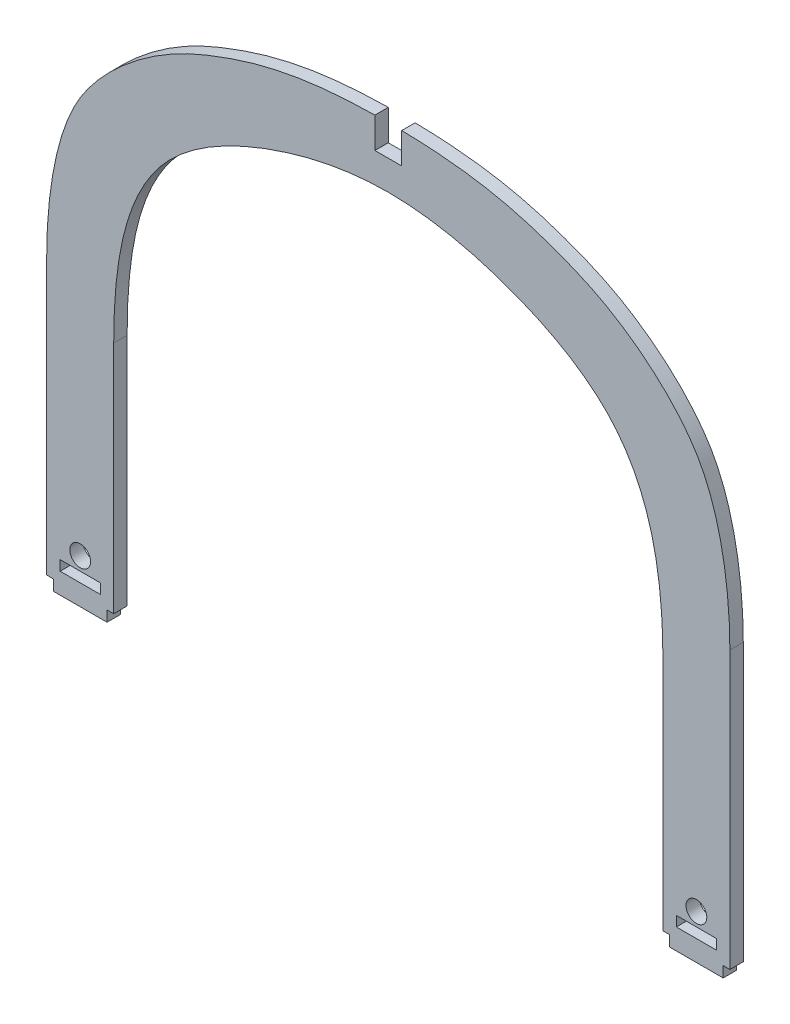
ISO-10303-21;
HEADER;
FILE_DESCRIPTION(('STEP AP214'),'2;1');
FILE_NAME('part.step','',(''),(''),'','','');
FILE_SCHEMA(('AUTOMOTIVE_DESIGN { 1 0 10303 214 1 1 1 1 }'));
ENDSEC;
DATA;
#1=APPLICATION_CONTEXT('core data for automotive mechanical design processes');
#2=APPLICATION_PROTOCOL_DEFINITION('international standard','automotive_design',2000,#1);
#3=PRODUCT_CONTEXT('',#1,'mechanical');
#4=PRODUCT('Part','Part','',(#3));
#5=PRODUCT_RELATED_PRODUCT_CATEGORY('part','',(#4));
#6=PRODUCT_DEFINITION_FORMATION('','',#4);
#7=PRODUCT_DEFINITION_CONTEXT('part definition',#1,'design');
#8=PRODUCT_DEFINITION('design','',#6,#7);
#9=PRODUCT_DEFINITION_SHAPE('','',#8);
#10=(LENGTH_UNIT() NAMED_UNIT(*) SI_UNIT(.MILLI.,.METRE.));
#11=(NAMED_UNIT(*) PLANE_ANGLE_UNIT() SI_UNIT($,.RADIAN.));
#12=(NAMED_UNIT(*) SI_UNIT($,.STERADIAN.) SOLID_ANGLE_UNIT());
#13=UNCERTAINTY_MEASURE_WITH_UNIT(LENGTH_MEASURE(1.E-05),#10,'distance_accuracy_value','');
#14=(GEOMETRIC_REPRESENTATION_CONTEXT(3) GLOBAL_UNCERTAINTY_ASSIGNED_CONTEXT((#13)) GLOBAL_UNIT_ASSIGNED_CONTEXT((#10,
#11,#12)) REPRESENTATION_CONTEXT('',''));
#15=CARTESIAN_POINT('',(0.,0.,0.));
#16=DIRECTION('',(0.,0.,1.));
#17=DIRECTION('',(1.,0.,0.));
#18=AXIS2_PLACEMENT_3D('',#15,#16,#17);
#19=CARTESIAN_POINT('',(0.,0.,2.));
#20=DIRECTION('',(1.,0.,0.));
#21=DIRECTION('',(0.,0.,-1.));
#22=AXIS2_PLACEMENT_3D('',#19,#20,#21);
#23=PLANE('',#22);
#24=DIRECTION('',(0.,-1.,0.));
#25=VECTOR('',#24,1.);
#26=CARTESIAN_POINT('',(0.,0.,0.));
#27=LINE('',#26,#25);
#28=CARTESIAN_POINT('',(0.,41.3187023405494,0.));
#29=VERTEX_POINT('',#28);
#30=CARTESIAN_POINT('',(0.,0.,0.));
#31=VERTEX_POINT('',#30);
#32=EDGE_CURVE('E373',#29,#31,#27,.T.);
#33=ORIENTED_EDGE('',*,*,#32,.T.);
#34=DIRECTION('',(0.,0.,-1.));
#35=VECTOR('',#34,1.);
#36=CARTESIAN_POINT('',(0.,0.,2.));
#37=LINE('',#36,#35);
#38=CARTESIAN_POINT('',(0.,0.,2.));
#39=VERTEX_POINT('',#38);
#40=EDGE_CURVE('E47',#39,#31,#37,.T.);
#41=ORIENTED_EDGE('',*,*,#40,.F.);
#42=DIRECTION('',(0.,-1.,0.));
#43=VECTOR('',#42,1.);
#44=CARTESIAN_POINT('',(0.,0.,2.));
#45=LINE('',#44,#43);
#46=CARTESIAN_POINT('',(0.,41.3187023405494,2.));
#47=VERTEX_POINT('',#46);
#48=EDGE_CURVE('E374',#47,#39,#45,.T.);
#49=ORIENTED_EDGE('',*,*,#48,.F.);
#50=DIRECTION('',(0.,0.,-1.));
#51=VECTOR('',#50,1.);
#52=CARTESIAN_POINT('',(0.,41.3187023405494,2.));
#53=LINE('',#52,#51);
#54=EDGE_CURVE('E534',#47,#29,#53,.T.);
#55=ORIENTED_EDGE('',*,*,#54,.T.);
#56=EDGE_LOOP('',(#33,#41,#49,#55));
#57=FACE_BOUND('',#56,.T.);
#58=ADVANCED_FACE('F39',(#57),#23,.F.);
#59=CARTESIAN_POINT('',(0.,0.,2.));
#60=DIRECTION('',(0.,1.,0.));
#61=DIRECTION('',(0.,0.,1.));
#62=AXIS2_PLACEMENT_3D('',#59,#60,#61);
#63=PLANE('',#62);
#64=DIRECTION('',(1.,0.,0.));
#65=VECTOR('',#64,1.);
#66=CARTESIAN_POINT('',(0.,0.,0.));
#67=LINE('',#66,#65);
#68=CARTESIAN_POINT('',(0.999999999999987,0.,0.));
#69=VERTEX_POINT('',#68);
#70=EDGE_CURVE('E447',#31,#69,#67,.T.);
#71=ORIENTED_EDGE('',*,*,#70,.T.);
#72=DIRECTION('',(0.,0.,-1.));
#73=VECTOR('',#72,1.);
#74=CARTESIAN_POINT('',(0.999999999999987,0.,2.));
#75=LINE('',#74,#73);
#76=CARTESIAN_POINT('',(0.999999999999987,0.,2.));
#77=VERTEX_POINT('',#76);
#78=EDGE_CURVE('E449',#77,#69,#75,.T.);
#79=ORIENTED_EDGE('',*,*,#78,.F.);
#80=DIRECTION('',(1.,0.,0.));
#81=VECTOR('',#80,1.);
#82=CARTESIAN_POINT('',(0.,0.,2.));
#83=LINE('',#82,#81);
#84=EDGE_CURVE('E378',#39,#77,#83,.T.);
#85=ORIENTED_EDGE('',*,*,#84,.F.);
#86=ORIENTED_EDGE('',*,*,#40,.T.);
#87=EDGE_LOOP('',(#71,#79,#85,#86));
#88=FACE_BOUND('',#87,.T.);
#89=ADVANCED_FACE('F437',(#88),#63,.F.);
#90=CARTESIAN_POINT('',(0.999999999999987,-1.6,2.));
#91=DIRECTION('',(1.,0.,0.));
#92=DIRECTION('',(0.,0.,-1.));
#93=AXIS2_PLACEMENT_3D('',#90,#91,#92);
#94=PLANE('',#93);
#95=DIRECTION('',(0.,-1.,0.));
#96=VECTOR('',#95,1.);
#97=CARTESIAN_POINT('',(0.999999999999987,-1.6,0.));
#98=LINE('',#97,#96);
#99=CARTESIAN_POINT('',(0.999999999999987,-1.6,0.));
#100=VERTEX_POINT('',#99);
#101=EDGE_CURVE('E457',#69,#100,#98,.T.);
#102=ORIENTED_EDGE('',*,*,#101,.T.);
#103=DIRECTION('',(0.,0.,-1.));
#104=VECTOR('',#103,1.);
#105=CARTESIAN_POINT('',(0.999999999999987,-1.6,2.));
#106=LINE('',#105,#104);
#107=CARTESIAN_POINT('',(0.999999999999987,-1.6,2.));
#108=VERTEX_POINT('',#107);
#109=EDGE_CURVE('E462',#108,#100,#106,.T.);
#110=ORIENTED_EDGE('',*,*,#109,.F.);
#111=DIRECTION('',(0.,-1.,0.));
#112=VECTOR('',#111,1.);
#113=CARTESIAN_POINT('',(0.999999999999987,-1.6,2.));
#114=LINE('',#113,#112);
#115=EDGE_CURVE('E382',#77,#108,#114,.T.);
#116=ORIENTED_EDGE('',*,*,#115,.F.);
#117=ORIENTED_EDGE('',*,*,#78,.T.);
#118=EDGE_LOOP('',(#102,#110,#116,#117));
#119=FACE_BOUND('',#118,.T.);
#120=ADVANCED_FACE('F434',(#119),#94,.F.);
#121=CARTESIAN_POINT('',(8.99999999999999,-1.6,2.));
#122=DIRECTION('',(0.,1.,0.));
#123=DIRECTION('',(0.,0.,1.));
#124=AXIS2_PLACEMENT_3D('',#121,#122,#123);
#125=PLANE('',#124);
#126=DIRECTION('',(1.,0.,0.));
#127=VECTOR('',#126,1.);
#128=CARTESIAN_POINT('',(8.99999999999999,-1.6,0.));
#129=LINE('',#128,#127);
#130=CARTESIAN_POINT('',(8.99999999999999,-1.6,0.));
#131=VERTEX_POINT('',#130);
#132=EDGE_CURVE('E468',#100,#131,#129,.T.);
#133=ORIENTED_EDGE('',*,*,#132,.T.);
#134=DIRECTION('',(0.,0.,-1.));
#135=VECTOR('',#134,1.);
#136=CARTESIAN_POINT('',(8.99999999999999,-1.6,2.));
#137=LINE('',#136,#135);
#138=CARTESIAN_POINT('',(8.99999999999999,-1.6,2.));
#139=VERTEX_POINT('',#138);
#140=EDGE_CURVE('E590',#139,#131,#137,.T.);
#141=ORIENTED_EDGE('',*,*,#140,.F.);
#142=DIRECTION('',(1.,0.,0.));
#143=VECTOR('',#142,1.);
#144=CARTESIAN_POINT('',(8.99999999999999,-1.6,2.));
#145=LINE('',#144,#143);
#146=EDGE_CURVE('E385',#108,#139,#145,.T.);
#147=ORIENTED_EDGE('',*,*,#146,.F.);
#148=ORIENTED_EDGE('',*,*,#109,.T.);
#149=EDGE_LOOP('',(#133,#141,#147,#148));
#150=FACE_BOUND('',#149,.T.);
#151=ADVANCED_FACE('F430',(#150),#125,.F.);
#152=CARTESIAN_POINT('',(8.99999999999999,-1.6,2.));
#153=DIRECTION('',(-1.,0.,0.));
#154=DIRECTION('',(0.,0.,1.));
#155=AXIS2_PLACEMENT_3D('',#152,#153,#154);
#156=PLANE('',#155);
#157=DIRECTION('',(0.,1.,0.));
#158=VECTOR('',#157,1.);
#159=CARTESIAN_POINT('',(8.99999999999999,-1.6,0.));
#160=LINE('',#159,#158);
#161=CARTESIAN_POINT('',(8.99999999999999,0.,0.));
#162=VERTEX_POINT('',#161);
#163=EDGE_CURVE('E472',#131,#162,#160,.T.);
#164=ORIENTED_EDGE('',*,*,#163,.T.);
#165=DIRECTION('',(0.,0.,-1.));
#166=VECTOR('',#165,1.);
#167=CARTESIAN_POINT('',(8.99999999999999,0.,2.));
#168=LINE('',#167,#166);
#169=CARTESIAN_POINT('',(8.99999999999999,0.,2.));
#170=VERTEX_POINT('',#169);
#171=EDGE_CURVE('E586',#170,#162,#168,.T.);
#172=ORIENTED_EDGE('',*,*,#171,.F.);
#173=DIRECTION('',(0.,1.,0.));
#174=VECTOR('',#173,1.);
#175=CARTESIAN_POINT('',(8.99999999999999,-1.6,2.));
#176=LINE('',#175,#174);
#177=EDGE_CURVE('E388',#139,#170,#176,.T.);
#178=ORIENTED_EDGE('',*,*,#177,.F.);
#179=ORIENTED_EDGE('',*,*,#140,.T.);
#180=EDGE_LOOP('',(#164,#172,#178,#179));
#181=FACE_BOUND('',#180,.T.);
#182=ADVANCED_FACE('F426',(#181),#156,.F.);
#183=CARTESIAN_POINT('',(8.99999999999999,0.,2.));
#184=DIRECTION('',(0.,1.,0.));
#185=DIRECTION('',(0.,0.,1.));
#186=AXIS2_PLACEMENT_3D('',#183,#184,#185);
#187=PLANE('',#186);
#188=DIRECTION('',(1.,0.,0.));
#189=VECTOR('',#188,1.);
#190=CARTESIAN_POINT('',(8.99999999999999,0.,0.));
#191=LINE('',#190,#189);
#192=CARTESIAN_POINT('',(10.,0.,0.));
#193=VERTEX_POINT('',#192);
#194=EDGE_CURVE('E478',#162,#193,#191,.T.);
#195=ORIENTED_EDGE('',*,*,#194,.T.);
#196=DIRECTION('',(0.,0.,-1.));
#197=VECTOR('',#196,1.);
#198=CARTESIAN_POINT('',(10.,0.,2.));
#199=LINE('',#198,#197);
#200=CARTESIAN_POINT('',(10.,0.,2.));
#201=VERTEX_POINT('',#200);
#202=EDGE_CURVE('E582',#201,#193,#199,.T.);
#203=ORIENTED_EDGE('',*,*,#202,.F.);
#204=DIRECTION('',(1.,0.,0.));
#205=VECTOR('',#204,1.);
#206=CARTESIAN_POINT('',(8.99999999999999,0.,2.));
#207=LINE('',#206,#205);
#208=EDGE_CURVE('E391',#170,#201,#207,.T.);
#209=ORIENTED_EDGE('',*,*,#208,.F.);
#210=ORIENTED_EDGE('',*,*,#171,.T.);
#211=EDGE_LOOP('',(#195,#203,#209,#210));
#212=FACE_BOUND('',#211,.T.);
#213=ADVANCED_FACE('F422',(#212),#187,.F.);
#214=CARTESIAN_POINT('',(10.,0.,2.));
#215=DIRECTION('',(-1.,0.,0.));
#216=DIRECTION('',(0.,0.,1.));
#217=AXIS2_PLACEMENT_3D('',#214,#215,#216);
#218=PLANE('',#217);
#219=DIRECTION('',(0.,1.,0.));
#220=VECTOR('',#219,1.);
#221=CARTESIAN_POINT('',(10.,0.,0.));
#222=LINE('',#221,#220);
#223=CARTESIAN_POINT('',(10.,35.,0.));
#224=VERTEX_POINT('',#223);
#225=EDGE_CURVE('E481',#193,#224,#222,.T.);
#226=ORIENTED_EDGE('',*,*,#225,.T.);
#227=DIRECTION('',(0.,0.,-1.));
#228=VECTOR('',#227,1.);
#229=CARTESIAN_POINT('',(10.,35.,2.));
#230=LINE('',#229,#228);
#231=CARTESIAN_POINT('',(10.,35.,2.));
#232=VERTEX_POINT('',#231);
#233=EDGE_CURVE('E578',#232,#224,#230,.T.);
#234=ORIENTED_EDGE('',*,*,#233,.F.);
#235=DIRECTION('',(0.,1.,0.));
#236=VECTOR('',#235,1.);
#237=CARTESIAN_POINT('',(10.,0.,2.));
#238=LINE('',#237,#236);
#239=EDGE_CURVE('E394',#201,#232,#238,.T.);
#240=ORIENTED_EDGE('',*,*,#239,.F.);
#241=ORIENTED_EDGE('',*,*,#202,.T.);
#242=EDGE_LOOP('',(#226,#234,#240,#241));
#243=FACE_BOUND('',#242,.T.);
#244=ADVANCED_FACE('F417',(#243),#218,.F.);
#245=CARTESIAN_POINT('',(10.,35.,2.));
#246=CARTESIAN_POINT('',(10.,45.9589332291043,2.));
#247=CARTESIAN_POINT('',(12.8021059266656,61.850376918426,2.));
#248=CARTESIAN_POINT('',(33.1389714038435,72.6057743338403,2.));
#249=CARTESIAN_POINT('',(45.150309794181,75.0000000000001,2.));
#250=CARTESIAN_POINT('',(51.,75.,2.));
#251=B_SPLINE_CURVE_WITH_KNOTS('',3,(#245,#246,#247,#248,#249,#250),.UNSPECIFIED.,.F.,.F.,(4,1,
1,4),(0.,0.441101429852636,0.72166621567052,1.),.UNSPECIFIED.);
#252=DIRECTION('',(0.,0.,-1.));
#253=VECTOR('',#252,1.);
#254=SURFACE_OF_LINEAR_EXTRUSION('',#251,#253);
#255=CARTESIAN_POINT('',(10.,35.,0.));
#256=CARTESIAN_POINT('',(10.,45.9589332291043,0.));
#257=CARTESIAN_POINT('',(12.8021059266656,61.850376918426,0.));
#258=CARTESIAN_POINT('',(33.1389714038435,72.6057743338403,0.));
#259=CARTESIAN_POINT('',(45.150309794181,75.0000000000001,0.));
#260=CARTESIAN_POINT('',(51.,75.,0.));
#261=B_SPLINE_CURVE_WITH_KNOTS('',3,(#255,#256,#257,#258,#259,#260),.UNSPECIFIED.,.F.,.F.,(4,1,
1,4),(0.,0.441101429852636,0.72166621567052,1.),.UNSPECIFIED.);
#262=CARTESIAN_POINT('',(51.,75.,0.));
#263=VERTEX_POINT('',#262);
#264=EDGE_CURVE('E484',#224,#263,#261,.T.);
#265=ORIENTED_EDGE('',*,*,#264,.T.);
#266=DIRECTION('',(0.,0.,-1.));
#267=VECTOR('',#266,1.);
#268=CARTESIAN_POINT('',(51.,75.,2.));
#269=LINE('',#268,#267);
#270=CARTESIAN_POINT('',(51.,75.,2.));
#271=VERTEX_POINT('',#270);
#272=EDGE_CURVE('E574',#271,#263,#269,.T.);
#273=ORIENTED_EDGE('',*,*,#272,.F.);
#274=EDGE_CURVE('E397',#232,#271,#251,.T.);
#275=ORIENTED_EDGE('',*,*,#274,.F.);
#276=ORIENTED_EDGE('',*,*,#233,.T.);
#277=EDGE_LOOP('',(#265,#273,#275,#276));
#278=FACE_BOUND('',#277,.T.);
#279=ADVANCED_FACE('F412',(#278),#254,.F.);
#280=CARTESIAN_POINT('',(51.,75.,2.));
#281=CARTESIAN_POINT('',(56.849690205819,75.0000000000001,2.));
#282=CARTESIAN_POINT('',(68.8610285961565,72.6057743338403,2.));
#283=CARTESIAN_POINT('',(89.1978940733344,61.850376918426,2.));
#284=CARTESIAN_POINT('',(91.9999999999999,45.9589332291043,2.));
#285=CARTESIAN_POINT('',(92.,35.,2.));
#286=B_SPLINE_CURVE_WITH_KNOTS('',3,(#280,#281,#282,#283,#284,#285),.UNSPECIFIED.,.F.,.F.,(4,1,
1,4),(0.,0.27833378432948,0.558898570147365,1.),.UNSPECIFIED.);
#287=DIRECTION('',(0.,0.,-1.));
#288=VECTOR('',#287,1.);
#289=SURFACE_OF_LINEAR_EXTRUSION('',#286,#288);
#290=CARTESIAN_POINT('',(51.,75.,0.));
#291=CARTESIAN_POINT('',(56.849690205819,75.0000000000001,0.));
#292=CARTESIAN_POINT('',(68.8610285961565,72.6057743338403,0.));
#293=CARTESIAN_POINT('',(89.1978940733344,61.850376918426,0.));
#294=CARTESIAN_POINT('',(91.9999999999999,45.9589332291043,0.));
#295=CARTESIAN_POINT('',(92.,35.,0.));
#296=B_SPLINE_CURVE_WITH_KNOTS('',3,(#290,#291,#292,#293,#294,#295),.UNSPECIFIED.,.F.,.F.,(4,1,
1,4),(0.,0.27833378432948,0.558898570147365,1.),.UNSPECIFIED.);
#297=CARTESIAN_POINT('',(92.,35.,0.));
#298=VERTEX_POINT('',#297);
#299=EDGE_CURVE('E489',#263,#298,#296,.T.);
#300=ORIENTED_EDGE('',*,*,#299,.T.);
#301=DIRECTION('',(0.,0.,-1.));
#302=VECTOR('',#301,1.);
#303=CARTESIAN_POINT('',(92.,35.,2.));
#304=LINE('',#303,#302);
#305=CARTESIAN_POINT('',(92.,35.,2.));
#306=VERTEX_POINT('',#305);
#307=EDGE_CURVE('E570',#306,#298,#304,.T.);
#308=ORIENTED_EDGE('',*,*,#307,.F.);
#309=EDGE_CURVE('E403',#271,#306,#286,.T.);
#310=ORIENTED_EDGE('',*,*,#309,.F.);
#311=ORIENTED_EDGE('',*,*,#272,.T.);
#312=EDGE_LOOP('',(#300,#308,#310,#311));
#313=FACE_BOUND('',#312,.T.);
#314=ADVANCED_FACE('F416',(#313),#289,.F.);
#315=CARTESIAN_POINT('',(92.,35.,2.));
#316=DIRECTION('',(1.,0.,0.));
#317=DIRECTION('',(0.,1.,0.));
#318=AXIS2_PLACEMENT_3D('',#315,#316,#317);
#319=PLANE('',#318);
#320=DIRECTION('',(0.,-1.,0.));
#321=VECTOR('',#320,1.);
#322=CARTESIAN_POINT('',(92.,35.,0.));
#323=LINE('',#322,#321);
#324=CARTESIAN_POINT('',(92.,0.,0.));
#325=VERTEX_POINT('',#324);
#326=EDGE_CURVE('E497',#298,#325,#323,.T.);
#327=ORIENTED_EDGE('',*,*,#326,.T.);
#328=DIRECTION('',(0.,0.,-1.));
#329=VECTOR('',#328,1.);
#330=CARTESIAN_POINT('',(92.,0.,2.));
#331=LINE('',#330,#329);
#332=CARTESIAN_POINT('',(92.,0.,2.));
#333=VERTEX_POINT('',#332);
#334=EDGE_CURVE('E566',#333,#325,#331,.T.);
#335=ORIENTED_EDGE('',*,*,#334,.F.);
#336=DIRECTION('',(0.,-1.,0.));
#337=VECTOR('',#336,1.);
#338=CARTESIAN_POINT('',(92.,35.,2.));
#339=LINE('',#338,#337);
#340=EDGE_CURVE('E620',#306,#333,#339,.T.);
#341=ORIENTED_EDGE('',*,*,#340,.F.);
#342=ORIENTED_EDGE('',*,*,#307,.T.);
#343=EDGE_LOOP('',(#327,#335,#341,#342));
#344=FACE_BOUND('',#343,.T.);
#345=ADVANCED_FACE('F634',(#344),#319,.F.);
#346=CARTESIAN_POINT('',(92.,0.,2.));
#347=DIRECTION('',(0.,1.,0.));
#348=DIRECTION('',(0.,0.,1.));
#349=AXIS2_PLACEMENT_3D('',#346,#347,#348);
#350=PLANE('',#349);
#351=DIRECTION('',(1.,0.,0.));
#352=VECTOR('',#351,1.);
#353=CARTESIAN_POINT('',(92.,0.,0.));
#354=LINE('',#353,#352);
#355=CARTESIAN_POINT('',(93.,0.,0.));
#356=VERTEX_POINT('',#355);
#357=EDGE_CURVE('E503',#325,#356,#354,.T.);
#358=ORIENTED_EDGE('',*,*,#357,.T.);
#359=DIRECTION('',(0.,0.,-1.));
#360=VECTOR('',#359,1.);
#361=CARTESIAN_POINT('',(93.,0.,2.));
#362=LINE('',#361,#360);
#363=CARTESIAN_POINT('',(93.,0.,2.));
#364=VERTEX_POINT('',#363);
#365=EDGE_CURVE('E562',#364,#356,#362,.T.);
#366=ORIENTED_EDGE('',*,*,#365,.F.);
#367=DIRECTION('',(1.,0.,0.));
#368=VECTOR('',#367,1.);
#369=CARTESIAN_POINT('',(92.,0.,2.));
#370=LINE('',#369,#368);
#371=EDGE_CURVE('E617',#333,#364,#370,.T.);
#372=ORIENTED_EDGE('',*,*,#371,.F.);
#373=ORIENTED_EDGE('',*,*,#334,.T.);
#374=EDGE_LOOP('',(#358,#366,#372,#373));
#375=FACE_BOUND('',#374,.T.);
#376=ADVANCED_FACE('F639',(#375),#350,.F.);
#377=CARTESIAN_POINT('',(93.,-1.6,2.));
#378=DIRECTION('',(1.,0.,0.));
#379=DIRECTION('',(0.,0.,-1.));
#380=AXIS2_PLACEMENT_3D('',#377,#378,#379);
#381=PLANE('',#380);
#382=DIRECTION('',(0.,-1.,0.));
#383=VECTOR('',#382,1.);
#384=CARTESIAN_POINT('',(93.,-1.6,0.));
#385=LINE('',#384,#383);
#386=CARTESIAN_POINT('',(93.,-1.6,0.));
#387=VERTEX_POINT('',#386);
#388=EDGE_CURVE('E506',#356,#387,#385,.T.);
#389=ORIENTED_EDGE('',*,*,#388,.T.);
#390=DIRECTION('',(0.,0.,-1.));
#391=VECTOR('',#390,1.);
#392=CARTESIAN_POINT('',(93.,-1.6,2.));
#393=LINE('',#392,#391);
#394=CARTESIAN_POINT('',(93.,-1.6,2.));
#395=VERTEX_POINT('',#394);
#396=EDGE_CURVE('E558',#395,#387,#393,.T.);
#397=ORIENTED_EDGE('',*,*,#396,.F.);
#398=DIRECTION('',(0.,-1.,0.));
#399=VECTOR('',#398,1.);
#400=CARTESIAN_POINT('',(93.,-1.6,2.));
#401=LINE('',#400,#399);
#402=EDGE_CURVE('E614',#364,#395,#401,.T.);
#403=ORIENTED_EDGE('',*,*,#402,.F.);
#404=ORIENTED_EDGE('',*,*,#365,.T.);
#405=EDGE_LOOP('',(#389,#397,#403,#404));
#406=FACE_BOUND('',#405,.T.);
#407=ADVANCED_FACE('F645',(#406),#381,.F.);
#408=CARTESIAN_POINT('',(93.,-1.6,2.));
#409=DIRECTION('',(0.,1.,0.));
#410=DIRECTION('',(0.,0.,1.));
#411=AXIS2_PLACEMENT_3D('',#408,#409,#410);
#412=PLANE('',#411);
#413=DIRECTION('',(1.,0.,0.));
#414=VECTOR('',#413,1.);
#415=CARTESIAN_POINT('',(93.,-1.6,0.));
#416=LINE('',#415,#414);
#417=CARTESIAN_POINT('',(101.,-1.6,0.));
#418=VERTEX_POINT('',#417);
#419=EDGE_CURVE('E509',#387,#418,#416,.T.);
#420=ORIENTED_EDGE('',*,*,#419,.T.);
#421=DIRECTION('',(0.,0.,-1.));
#422=VECTOR('',#421,1.);
#423=CARTESIAN_POINT('',(101.,-1.6,2.));
#424=LINE('',#423,#422);
#425=CARTESIAN_POINT('',(101.,-1.6,2.));
#426=VERTEX_POINT('',#425);
#427=EDGE_CURVE('E554',#426,#418,#424,.T.);
#428=ORIENTED_EDGE('',*,*,#427,.F.);
#429=DIRECTION('',(1.,0.,0.));
#430=VECTOR('',#429,1.);
#431=CARTESIAN_POINT('',(93.,-1.6,2.));
#432=LINE('',#431,#430);
#433=EDGE_CURVE('E611',#395,#426,#432,.T.);
#434=ORIENTED_EDGE('',*,*,#433,.F.);
#435=ORIENTED_EDGE('',*,*,#396,.T.);
#436=EDGE_LOOP('',(#420,#428,#434,#435));
#437=FACE_BOUND('',#436,.T.);
#438=ADVANCED_FACE('F649',(#437),#412,.F.);
#439=CARTESIAN_POINT('',(101.,-1.6,2.));
#440=DIRECTION('',(-1.,0.,0.));
#441=DIRECTION('',(0.,0.,1.));
#442=AXIS2_PLACEMENT_3D('',#439,#440,#441);
#443=PLANE('',#442);
#444=DIRECTION('',(0.,1.,0.));
#445=VECTOR('',#444,1.);
#446=CARTESIAN_POINT('',(101.,-1.6,0.));
#447=LINE('',#446,#445);
#448=CARTESIAN_POINT('',(101.,0.,0.));
#449=VERTEX_POINT('',#448);
#450=EDGE_CURVE('E512',#418,#449,#447,.T.);
#451=ORIENTED_EDGE('',*,*,#450,.T.);
#452=DIRECTION('',(0.,0.,-1.));
#453=VECTOR('',#452,1.);
#454=CARTESIAN_POINT('',(101.,0.,2.));
#455=LINE('',#454,#453);
#456=CARTESIAN_POINT('',(101.,0.,2.));
#457=VERTEX_POINT('',#456);
#458=EDGE_CURVE('E550',#457,#449,#455,.T.);
#459=ORIENTED_EDGE('',*,*,#458,.F.);
#460=DIRECTION('',(0.,1.,0.));
#461=VECTOR('',#460,1.);
#462=CARTESIAN_POINT('',(101.,-1.6,2.));
#463=LINE('',#462,#461);
#464=EDGE_CURVE('E608',#426,#457,#463,.T.);
#465=ORIENTED_EDGE('',*,*,#464,.F.);
#466=ORIENTED_EDGE('',*,*,#427,.T.);
#467=EDGE_LOOP('',(#451,#459,#465,#466));
#468=FACE_BOUND('',#467,.T.);
#469=ADVANCED_FACE('F654',(#468),#443,.F.);
#470=CARTESIAN_POINT('',(101.,0.,2.));
#471=DIRECTION('',(0.,1.,0.));
#472=DIRECTION('',(0.,0.,1.));
#473=AXIS2_PLACEMENT_3D('',#470,#471,#472);
#474=PLANE('',#473);
#475=DIRECTION('',(1.,0.,0.));
#476=VECTOR('',#475,1.);
#477=CARTESIAN_POINT('',(101.,0.,0.));
#478=LINE('',#477,#476);
#479=CARTESIAN_POINT('',(102.,0.,0.));
#480=VERTEX_POINT('',#479);
#481=EDGE_CURVE('E515',#449,#480,#478,.T.);
#482=ORIENTED_EDGE('',*,*,#481,.T.);
#483=DIRECTION('',(0.,0.,-1.));
#484=VECTOR('',#483,1.);
#485=CARTESIAN_POINT('',(102.,0.,2.));
#486=LINE('',#485,#484);
#487=CARTESIAN_POINT('',(102.,0.,2.));
#488=VERTEX_POINT('',#487);
#489=EDGE_CURVE('E546',#488,#480,#486,.T.);
#490=ORIENTED_EDGE('',*,*,#489,.F.);
#491=DIRECTION('',(1.,0.,0.));
#492=VECTOR('',#491,1.);
#493=CARTESIAN_POINT('',(101.,0.,2.));
#494=LINE('',#493,#492);
#495=EDGE_CURVE('E605',#457,#488,#494,.T.);
#496=ORIENTED_EDGE('',*,*,#495,.F.);
#497=ORIENTED_EDGE('',*,*,#458,.T.);
#498=EDGE_LOOP('',(#482,#490,#496,#497));
#499=FACE_BOUND('',#498,.T.);
#500=ADVANCED_FACE('F660',(#499),#474,.F.);
#501=CARTESIAN_POINT('',(102.,0.,2.));
#502=DIRECTION('',(-1.,0.,0.));
#503=DIRECTION('',(0.,-1.,0.));
#504=AXIS2_PLACEMENT_3D('',#501,#502,#503);
#505=PLANE('',#504);
#506=DIRECTION('',(0.,1.,0.));
#507=VECTOR('',#506,1.);
#508=CARTESIAN_POINT('',(102.,0.,0.));
#509=LINE('',#508,#507);
#510=CARTESIAN_POINT('',(102.,41.3187023405494,0.));
#511=VERTEX_POINT('',#510);
#512=EDGE_CURVE('E518',#480,#511,#509,.T.);
#513=ORIENTED_EDGE('',*,*,#512,.T.);
#514=DIRECTION('',(0.,0.,-1.));
#515=VECTOR('',#514,1.);
#516=CARTESIAN_POINT('',(102.,41.3187023405494,2.));
#517=LINE('',#516,#515);
#518=CARTESIAN_POINT('',(102.,41.3187023405494,2.));
#519=VERTEX_POINT('',#518);
#520=EDGE_CURVE('E541',#519,#511,#517,.T.);
#521=ORIENTED_EDGE('',*,*,#520,.F.);
#522=DIRECTION('',(0.,1.,0.));
#523=VECTOR('',#522,1.);
#524=CARTESIAN_POINT('',(102.,0.,2.));
#525=LINE('',#524,#523);
#526=EDGE_CURVE('E602',#488,#519,#525,.T.);
#527=ORIENTED_EDGE('',*,*,#526,.F.);
#528=ORIENTED_EDGE('',*,*,#489,.T.);
#529=EDGE_LOOP('',(#513,#521,#527,#528));
#530=FACE_BOUND('',#529,.T.);
#531=ADVANCED_FACE('F664',(#530),#505,.F.);
#532=CARTESIAN_POINT('',(102.,41.3187023405494,2.));
#533=CARTESIAN_POINT('',(102.,48.3905761195159,2.));
#534=CARTESIAN_POINT('',(100.674869511675,58.8306988628621,2.));
#535=CARTESIAN_POINT('',(93.3281020768561,69.833438872415,2.));
#536=CARTESIAN_POINT('',(85.6023579202091,76.0793850670253,2.));
#537=CARTESIAN_POINT('',(71.2604452406079,82.0516073083705,2.));
#538=CARTESIAN_POINT('',(62.6387129042451,84.0000000000001,2.));
#539=CARTESIAN_POINT('',(50.9999999999999,84.,2.));
#540=B_SPLINE_CURVE_WITH_KNOTS('',3,(#532,#533,#534,#535,#536,#537,#538,#539),.UNSPECIFIED.,.F.,
.F.,(4,1,1,1,1,4),(0.,0.315306945891325,0.380759929780851,0.624110960104773,0.689076855005737,
1.),.UNSPECIFIED.);
#541=DIRECTION('',(0.,0.,-1.));
#542=VECTOR('',#541,1.);
#543=SURFACE_OF_LINEAR_EXTRUSION('',#540,#542);
#544=CARTESIAN_POINT('',(102.,41.3187023405494,0.));
#545=CARTESIAN_POINT('',(102.,48.3905761195159,0.));
#546=CARTESIAN_POINT('',(100.674869511675,58.8306988628621,0.));
#547=CARTESIAN_POINT('',(93.3281020768561,69.833438872415,0.));
#548=CARTESIAN_POINT('',(85.6023579202091,76.0793850670253,0.));
#549=CARTESIAN_POINT('',(71.2604452406079,82.0516073083705,0.));
#550=CARTESIAN_POINT('',(62.6387129042451,84.0000000000001,0.));
#551=CARTESIAN_POINT('',(50.9999999999999,84.,0.));
#552=B_SPLINE_CURVE_WITH_KNOTS('',3,(#544,#545,#546,#547,#548,#549,#550,#551),.UNSPECIFIED.,.F.,
.F.,(4,1,1,1,1,4),(0.,0.315306945891325,0.380759929780851,0.624110960104773,0.689076855005737,
1.),.UNSPECIFIED.);
#553=CARTESIAN_POINT('',(53.,83.9835000856169,0.));
#554=VERTEX_POINT('',#553);
#555=EDGE_CURVE('E521',#511,#554,#552,.T.);
#556=ORIENTED_EDGE('',*,*,#555,.T.);
#557=DIRECTION('',(0.,0.,-1.));
#558=VECTOR('',#557,1.);
#559=CARTESIAN_POINT('',(53.,83.983500085454,2.));
#560=LINE('',#559,#558);
#561=CARTESIAN_POINT('',(53.,83.9835000856169,2.));
#562=VERTEX_POINT('',#561);
#563=EDGE_CURVE('E369',#554,#562,#560,.F.);
#564=ORIENTED_EDGE('',*,*,#563,.T.);
#565=EDGE_CURVE('E598',#519,#562,#540,.T.);
#566=ORIENTED_EDGE('',*,*,#565,.F.);
#567=ORIENTED_EDGE('',*,*,#520,.T.);
#568=EDGE_LOOP('',(#556,#564,#566,#567));
#569=FACE_BOUND('',#568,.T.);
#570=ADVANCED_FACE('F668',(#569),#543,.F.);
#571=CARTESIAN_POINT('',(51.0000000000001,84.,2.));
#572=CARTESIAN_POINT('',(39.3612870957549,84.0000000000001,2.));
#573=CARTESIAN_POINT('',(30.7395547593921,82.0516073083705,2.));
#574=CARTESIAN_POINT('',(16.3976420797909,76.0793850670253,2.));
#575=CARTESIAN_POINT('',(8.67189792314387,69.833438872415,2.));
#576=CARTESIAN_POINT('',(1.32513048832462,58.8306988628621,2.));
#577=CARTESIAN_POINT('',(0.,48.3905761195159,2.));
#578=CARTESIAN_POINT('',(0.,41.3187023405494,2.));
#579=B_SPLINE_CURVE_WITH_KNOTS('',3,(#571,#572,#573,#574,#575,#576,#577,#578),.UNSPECIFIED.,.F.,
.F.,(4,1,1,1,1,4),(0.,0.310923144994263,0.375889039895227,0.619240070219149,0.684693054108675,
1.),.UNSPECIFIED.);
#580=DIRECTION('',(0.,0.,-1.));
#581=VECTOR('',#580,1.);
#582=SURFACE_OF_LINEAR_EXTRUSION('',#579,#581);
#583=CARTESIAN_POINT('',(49.,83.9835000856169,2.));
#584=VERTEX_POINT('',#583);
#585=EDGE_CURVE('E542',#584,#47,#579,.T.);
#586=ORIENTED_EDGE('',*,*,#585,.F.);
#587=DIRECTION('',(0.,0.,-1.));
#588=VECTOR('',#587,1.);
#589=CARTESIAN_POINT('',(49.,83.983500085454,2.));
#590=LINE('',#589,#588);
#591=CARTESIAN_POINT('',(49.,83.9835000856169,0.));
#592=VERTEX_POINT('',#591);
#593=EDGE_CURVE('E363',#584,#592,#590,.T.);
#594=ORIENTED_EDGE('',*,*,#593,.T.);
#595=CARTESIAN_POINT('',(51.0000000000001,84.,0.));
#596=CARTESIAN_POINT('',(39.3612870957549,84.0000000000001,0.));
#597=CARTESIAN_POINT('',(30.7395547593921,82.0516073083705,0.));
#598=CARTESIAN_POINT('',(16.3976420797909,76.0793850670253,0.));
#599=CARTESIAN_POINT('',(8.67189792314387,69.833438872415,0.));
#600=CARTESIAN_POINT('',(1.32513048832462,58.8306988628621,0.));
#601=CARTESIAN_POINT('',(0.,48.3905761195159,0.));
#602=CARTESIAN_POINT('',(0.,41.3187023405494,0.));
#603=B_SPLINE_CURVE_WITH_KNOTS('',3,(#595,#596,#597,#598,#599,#600,#601,#602),.UNSPECIFIED.,.F.,
.F.,(4,1,1,1,1,4),(0.,0.310923144994263,0.375889039895227,0.619240070219149,0.684693054108675,
1.),.UNSPECIFIED.);
#604=EDGE_CURVE('E379',#592,#29,#603,.T.);
#605=ORIENTED_EDGE('',*,*,#604,.T.);
#606=ORIENTED_EDGE('',*,*,#54,.F.);
#607=EDGE_LOOP('',(#586,#594,#605,#606));
#608=FACE_BOUND('',#607,.T.);
#609=ADVANCED_FACE('F682',(#608),#582,.F.);
#610=CARTESIAN_POINT('',(12.6714335856182,72.6553438480113,2.));
#611=DIRECTION('',(0.,0.,1.));
#612=DIRECTION('',(1.,0.,0.));
#613=AXIS2_PLACEMENT_3D('',#610,#611,#612);
#614=PLANE('',#613);
#615=DIRECTION('',(0.,-1.,0.));
#616=VECTOR('',#615,1.);
#617=CARTESIAN_POINT('',(100.,3.,2.));
#618=LINE('',#617,#616);
#619=CARTESIAN_POINT('',(100.,3.,2.));
#620=VERTEX_POINT('',#619);
#621=CARTESIAN_POINT('',(100.,1.5,2.));
#622=VERTEX_POINT('',#621);
#623=EDGE_CURVE('E234',#620,#622,#618,.T.);
#624=ORIENTED_EDGE('',*,*,#623,.T.);
#625=DIRECTION('',(-1.,0.,0.));
#626=VECTOR('',#625,1.);
#627=CARTESIAN_POINT('',(100.,1.5,2.));
#628=LINE('',#627,#626);
#629=CARTESIAN_POINT('',(94.,1.5,2.));
#630=VERTEX_POINT('',#629);
#631=EDGE_CURVE('E246',#622,#630,#628,.T.);
#632=ORIENTED_EDGE('',*,*,#631,.T.);
#633=DIRECTION('',(0.,1.,0.));
#634=VECTOR('',#633,1.);
#635=CARTESIAN_POINT('',(94.,1.5,2.));
#636=LINE('',#635,#634);
#637=CARTESIAN_POINT('',(94.,3.,2.));
#638=VERTEX_POINT('',#637);
#639=EDGE_CURVE('E54',#630,#638,#636,.T.);
#640=ORIENTED_EDGE('',*,*,#639,.T.);
#641=DIRECTION('',(1.,0.,0.));
#642=VECTOR('',#641,1.);
#643=CARTESIAN_POINT('',(94.,3.,2.));
#644=LINE('',#643,#642);
#645=EDGE_CURVE('E243',#638,#620,#644,.T.);
#646=ORIENTED_EDGE('',*,*,#645,.T.);
#647=EDGE_LOOP('',(#624,#632,#640,#646));
#648=FACE_BOUND('',#647,.T.);
#649=DIRECTION('',(-1.,0.,0.));
#650=VECTOR('',#649,1.);
#651=CARTESIAN_POINT('',(1.99999999999999,1.5,2.));
#652=LINE('',#651,#650);
#653=CARTESIAN_POINT('',(7.99999999999999,1.5,2.));
#654=VERTEX_POINT('',#653);
#655=CARTESIAN_POINT('',(1.99999999999999,1.5,2.));
#656=VERTEX_POINT('',#655);
#657=EDGE_CURVE('E284',#654,#656,#652,.T.);
#658=ORIENTED_EDGE('',*,*,#657,.T.);
#659=DIRECTION('',(0.,1.,0.));
#660=VECTOR('',#659,1.);
#661=CARTESIAN_POINT('',(1.99999999999999,3.,2.));
#662=LINE('',#661,#660);
#663=CARTESIAN_POINT('',(1.99999999999999,3.,2.));
#664=VERTEX_POINT('',#663);
#665=EDGE_CURVE('E288',#656,#664,#662,.T.);
#666=ORIENTED_EDGE('',*,*,#665,.T.);
#667=DIRECTION('',(1.,0.,0.));
#668=VECTOR('',#667,1.);
#669=CARTESIAN_POINT('',(7.99999999999999,3.,2.));
#670=LINE('',#669,#668);
#671=CARTESIAN_POINT('',(7.99999999999999,3.,2.));
#672=VERTEX_POINT('',#671);
#673=EDGE_CURVE('E62',#664,#672,#670,.T.);
#674=ORIENTED_EDGE('',*,*,#673,.T.);
#675=DIRECTION('',(0.,-1.,0.));
#676=VECTOR('',#675,1.);
#677=CARTESIAN_POINT('',(7.99999999999999,1.5,2.));
#678=LINE('',#677,#676);
#679=EDGE_CURVE('E295',#672,#654,#678,.T.);
#680=ORIENTED_EDGE('',*,*,#679,.T.);
#681=EDGE_LOOP('',(#658,#666,#674,#680));
#682=FACE_BOUND('',#681,.T.);
#683=CARTESIAN_POINT('',(97.,5.,2.));
#684=DIRECTION('',(0.,0.,-1.));
#685=DIRECTION('',(-1.,0.,0.));
#686=AXIS2_PLACEMENT_3D('',#683,#684,#685);
#687=CIRCLE('',#686,1.54999999999999);
#688=CARTESIAN_POINT('',(95.45,5.,2.));
#689=VERTEX_POINT('',#688);
#690=EDGE_CURVE('E325',#689,#689,#687,.T.);
#691=ORIENTED_EDGE('',*,*,#690,.T.);
#692=EDGE_LOOP('',(#691));
#693=FACE_BOUND('',#692,.T.);
#694=CARTESIAN_POINT('',(4.99999999999999,5.00000000000001,2.));
#695=DIRECTION('',(0.,0.,-1.));
#696=DIRECTION('',(1.,0.,0.));
#697=AXIS2_PLACEMENT_3D('',#694,#695,#696);
#698=CIRCLE('',#697,1.54999999999999);
#699=CARTESIAN_POINT('',(6.54999999999998,5.00000000000001,2.));
#700=VERTEX_POINT('',#699);
#701=EDGE_CURVE('E334',#700,#700,#698,.T.);
#702=ORIENTED_EDGE('',*,*,#701,.T.);
#703=EDGE_LOOP('',(#702));
#704=FACE_BOUND('',#703,.T.);
#705=DIRECTION('',(0.,-1.,0.));
#706=VECTOR('',#705,1.);
#707=CARTESIAN_POINT('',(53.,86.,2.));
#708=LINE('',#707,#706);
#709=CARTESIAN_POINT('',(53.,79.4,2.));
#710=VERTEX_POINT('',#709);
#711=EDGE_CURVE('E341',#562,#710,#708,.T.);
#712=ORIENTED_EDGE('',*,*,#711,.T.);
#713=DIRECTION('',(-1.,0.,0.));
#714=VECTOR('',#713,1.);
#715=CARTESIAN_POINT('',(53.,79.4,2.));
#716=LINE('',#715,#714);
#717=CARTESIAN_POINT('',(49.,79.4,2.));
#718=VERTEX_POINT('',#717);
#719=EDGE_CURVE('E345',#710,#718,#716,.T.);
#720=ORIENTED_EDGE('',*,*,#719,.T.);
#721=DIRECTION('',(0.,1.,0.));
#722=VECTOR('',#721,1.);
#723=CARTESIAN_POINT('',(49.,79.4,2.));
#724=LINE('',#723,#722);
#725=EDGE_CURVE('E350',#718,#584,#724,.T.);
#726=ORIENTED_EDGE('',*,*,#725,.T.);
#727=ORIENTED_EDGE('',*,*,#585,.T.);
#728=ORIENTED_EDGE('',*,*,#48,.T.);
#729=ORIENTED_EDGE('',*,*,#84,.T.);
#730=ORIENTED_EDGE('',*,*,#115,.T.);
#731=ORIENTED_EDGE('',*,*,#146,.T.);
#732=ORIENTED_EDGE('',*,*,#177,.T.);
#733=ORIENTED_EDGE('',*,*,#208,.T.);
#734=ORIENTED_EDGE('',*,*,#239,.T.);
#735=ORIENTED_EDGE('',*,*,#274,.T.);
#736=ORIENTED_EDGE('',*,*,#309,.T.);
#737=ORIENTED_EDGE('',*,*,#340,.T.);
#738=ORIENTED_EDGE('',*,*,#371,.T.);
#739=ORIENTED_EDGE('',*,*,#402,.T.);
#740=ORIENTED_EDGE('',*,*,#433,.T.);
#741=ORIENTED_EDGE('',*,*,#464,.T.);
#742=ORIENTED_EDGE('',*,*,#495,.T.);
#743=ORIENTED_EDGE('',*,*,#526,.T.);
#744=ORIENTED_EDGE('',*,*,#565,.T.);
#745=EDGE_LOOP('',(#712,#720,#726,#727,#728,#729,#730,#731,#732,#733,#734,#735,#736,#737,#738,
#739,#740,#741,#742,#743,#744));
#746=FACE_BOUND('',#745,.T.);
#747=ADVANCED_FACE('F251',(#648,#682,#693,#704,#746),#614,.T.);
#748=CARTESIAN_POINT('',(12.6714335856182,72.6553438480113,0.));
#749=DIRECTION('',(0.,0.,1.));
#750=DIRECTION('',(1.,0.,0.));
#751=AXIS2_PLACEMENT_3D('',#748,#749,#750);
#752=PLANE('',#751);
#753=DIRECTION('',(-1.,0.,0.));
#754=VECTOR('',#753,1.);
#755=CARTESIAN_POINT('',(100.,1.5,0.));
#756=LINE('',#755,#754);
#757=CARTESIAN_POINT('',(100.,1.5,0.));
#758=VERTEX_POINT('',#757);
#759=CARTESIAN_POINT('',(94.,1.5,0.));
#760=VERTEX_POINT('',#759);
#761=EDGE_CURVE('E268',#758,#760,#756,.T.);
#762=ORIENTED_EDGE('',*,*,#761,.F.);
#763=DIRECTION('',(0.,-1.,0.));
#764=VECTOR('',#763,1.);
#765=CARTESIAN_POINT('',(100.,3.,0.));
#766=LINE('',#765,#764);
#767=CARTESIAN_POINT('',(100.,3.,0.));
#768=VERTEX_POINT('',#767);
#769=EDGE_CURVE('E237',#768,#758,#766,.T.);
#770=ORIENTED_EDGE('',*,*,#769,.F.);
#771=DIRECTION('',(1.,0.,0.));
#772=VECTOR('',#771,1.);
#773=CARTESIAN_POINT('',(94.,3.,0.));
#774=LINE('',#773,#772);
#775=CARTESIAN_POINT('',(94.,3.,0.));
#776=VERTEX_POINT('',#775);
#777=EDGE_CURVE('E255',#776,#768,#774,.T.);
#778=ORIENTED_EDGE('',*,*,#777,.F.);
#779=DIRECTION('',(0.,1.,0.));
#780=VECTOR('',#779,1.);
#781=CARTESIAN_POINT('',(94.,1.5,0.));
#782=LINE('',#781,#780);
#783=EDGE_CURVE('E259',#760,#776,#782,.T.);
#784=ORIENTED_EDGE('',*,*,#783,.F.);
#785=EDGE_LOOP('',(#762,#770,#778,#784));
#786=FACE_BOUND('',#785,.T.);
#787=DIRECTION('',(0.,1.,0.));
#788=VECTOR('',#787,1.);
#789=CARTESIAN_POINT('',(1.99999999999999,3.,0.));
#790=LINE('',#789,#788);
#791=CARTESIAN_POINT('',(1.99999999999999,1.5,0.));
#792=VERTEX_POINT('',#791);
#793=CARTESIAN_POINT('',(1.99999999999999,3.,0.));
#794=VERTEX_POINT('',#793);
#795=EDGE_CURVE('E303',#792,#794,#790,.T.);
#796=ORIENTED_EDGE('',*,*,#795,.F.);
#797=DIRECTION('',(-1.,0.,0.));
#798=VECTOR('',#797,1.);
#799=CARTESIAN_POINT('',(1.99999999999999,1.5,0.));
#800=LINE('',#799,#798);
#801=CARTESIAN_POINT('',(7.99999999999999,1.5,0.));
#802=VERTEX_POINT('',#801);
#803=EDGE_CURVE('E300',#802,#792,#800,.T.);
#804=ORIENTED_EDGE('',*,*,#803,.F.);
#805=DIRECTION('',(0.,-1.,0.));
#806=VECTOR('',#805,1.);
#807=CARTESIAN_POINT('',(7.99999999999999,1.5,0.));
#808=LINE('',#807,#806);
#809=CARTESIAN_POINT('',(7.99999999999999,3.,0.));
#810=VERTEX_POINT('',#809);
#811=EDGE_CURVE('E289',#810,#802,#808,.T.);
#812=ORIENTED_EDGE('',*,*,#811,.F.);
#813=DIRECTION('',(1.,0.,0.));
#814=VECTOR('',#813,1.);
#815=CARTESIAN_POINT('',(7.99999999999999,3.,0.));
#816=LINE('',#815,#814);
#817=EDGE_CURVE('E307',#794,#810,#816,.T.);
#818=ORIENTED_EDGE('',*,*,#817,.F.);
#819=EDGE_LOOP('',(#796,#804,#812,#818));
#820=FACE_BOUND('',#819,.T.);
#821=CARTESIAN_POINT('',(97.,5.,0.));
#822=DIRECTION('',(0.,0.,-1.));
#823=DIRECTION('',(-1.,0.,0.));
#824=AXIS2_PLACEMENT_3D('',#821,#822,#823);
#825=CIRCLE('',#824,1.54999999999999);
#826=CARTESIAN_POINT('',(95.45,5.,0.));
#827=VERTEX_POINT('',#826);
#828=EDGE_CURVE('E330',#827,#827,#825,.T.);
#829=ORIENTED_EDGE('',*,*,#828,.F.);
#830=EDGE_LOOP('',(#829));
#831=FACE_BOUND('',#830,.T.);
#832=CARTESIAN_POINT('',(4.99999999999999,5.00000000000001,0.));
#833=DIRECTION('',(0.,0.,-1.));
#834=DIRECTION('',(1.,0.,0.));
#835=AXIS2_PLACEMENT_3D('',#832,#833,#834);
#836=CIRCLE('',#835,1.54999999999999);
#837=CARTESIAN_POINT('',(6.54999999999998,5.00000000000001,0.));
#838=VERTEX_POINT('',#837);
#839=EDGE_CURVE('E278',#838,#838,#836,.T.);
#840=ORIENTED_EDGE('',*,*,#839,.F.);
#841=EDGE_LOOP('',(#840));
#842=FACE_BOUND('',#841,.T.);
#843=DIRECTION('',(-1.,0.,0.));
#844=VECTOR('',#843,1.);
#845=CARTESIAN_POINT('',(53.,79.4,0.));
#846=LINE('',#845,#844);
#847=CARTESIAN_POINT('',(53.,79.4,0.));
#848=VERTEX_POINT('',#847);
#849=CARTESIAN_POINT('',(49.,79.4,0.));
#850=VERTEX_POINT('',#849);
#851=EDGE_CURVE('E329',#848,#850,#846,.T.);
#852=ORIENTED_EDGE('',*,*,#851,.F.);
#853=DIRECTION('',(0.,1.,0.));
#854=VECTOR('',#853,1.);
#855=CARTESIAN_POINT('',(53.,72.6553438480113,0.));
#856=LINE('',#855,#854);
#857=EDGE_CURVE('E11',#848,#554,#856,.T.);
#858=ORIENTED_EDGE('',*,*,#857,.T.);
#859=ORIENTED_EDGE('',*,*,#555,.F.);
#860=ORIENTED_EDGE('',*,*,#512,.F.);
#861=ORIENTED_EDGE('',*,*,#481,.F.);
#862=ORIENTED_EDGE('',*,*,#450,.F.);
#863=ORIENTED_EDGE('',*,*,#419,.F.);
#864=ORIENTED_EDGE('',*,*,#388,.F.);
#865=ORIENTED_EDGE('',*,*,#357,.F.);
#866=ORIENTED_EDGE('',*,*,#326,.F.);
#867=ORIENTED_EDGE('',*,*,#299,.F.);
#868=ORIENTED_EDGE('',*,*,#264,.F.);
#869=ORIENTED_EDGE('',*,*,#225,.F.);
#870=ORIENTED_EDGE('',*,*,#194,.F.);
#871=ORIENTED_EDGE('',*,*,#163,.F.);
#872=ORIENTED_EDGE('',*,*,#132,.F.);
#873=ORIENTED_EDGE('',*,*,#101,.F.);
#874=ORIENTED_EDGE('',*,*,#70,.F.);
#875=ORIENTED_EDGE('',*,*,#32,.F.);
#876=ORIENTED_EDGE('',*,*,#604,.F.);
#877=DIRECTION('',(0.,1.,0.));
#878=VECTOR('',#877,1.);
#879=CARTESIAN_POINT('',(49.,79.4,0.));
#880=LINE('',#879,#878);
#881=EDGE_CURVE('E346',#850,#592,#880,.T.);
#882=ORIENTED_EDGE('',*,*,#881,.F.);
#883=EDGE_LOOP('',(#852,#858,#859,#860,#861,#862,#863,#864,#865,#866,#867,#868,#869,#870,#871,
#872,#873,#874,#875,#876,#882));
#884=FACE_BOUND('',#883,.T.);
#885=ADVANCED_FACE('F466',(#786,#820,#831,#842,#884),#752,.F.);
#886=CARTESIAN_POINT('',(53.,86.,2.));
#887=DIRECTION('',(1.,0.,0.));
#888=DIRECTION('',(0.,0.,-1.));
#889=AXIS2_PLACEMENT_3D('',#886,#887,#888);
#890=PLANE('',#889);
#891=ORIENTED_EDGE('',*,*,#857,.F.);
#892=DIRECTION('',(0.,0.,-1.));
#893=VECTOR('',#892,1.);
#894=CARTESIAN_POINT('',(53.,79.4,2.));
#895=LINE('',#894,#893);
#896=EDGE_CURVE('E354',#710,#848,#895,.T.);
#897=ORIENTED_EDGE('',*,*,#896,.F.);
#898=ORIENTED_EDGE('',*,*,#711,.F.);
#899=ORIENTED_EDGE('',*,*,#563,.F.);
#900=EDGE_LOOP('',(#891,#897,#898,#899));
#901=FACE_BOUND('',#900,.T.);
#902=ADVANCED_FACE('F672',(#901),#890,.F.);
#903=CARTESIAN_POINT('',(49.,79.4,2.));
#904=DIRECTION('',(-1.,0.,0.));
#905=DIRECTION('',(0.,0.,1.));
#906=AXIS2_PLACEMENT_3D('',#903,#904,#905);
#907=PLANE('',#906);
#908=ORIENTED_EDGE('',*,*,#725,.F.);
#909=DIRECTION('',(0.,0.,-1.));
#910=VECTOR('',#909,1.);
#911=CARTESIAN_POINT('',(49.,79.4,2.));
#912=LINE('',#911,#910);
#913=EDGE_CURVE('E360',#718,#850,#912,.T.);
#914=ORIENTED_EDGE('',*,*,#913,.T.);
#915=ORIENTED_EDGE('',*,*,#881,.T.);
#916=ORIENTED_EDGE('',*,*,#593,.F.);
#917=EDGE_LOOP('',(#908,#914,#915,#916));
#918=FACE_BOUND('',#917,.T.);
#919=ADVANCED_FACE('F678',(#918),#907,.F.);
#920=CARTESIAN_POINT('',(53.,79.4,2.));
#921=DIRECTION('',(0.,-1.,0.));
#922=DIRECTION('',(1.,0.,0.));
#923=AXIS2_PLACEMENT_3D('',#920,#921,#922);
#924=PLANE('',#923);
#925=ORIENTED_EDGE('',*,*,#851,.T.);
#926=ORIENTED_EDGE('',*,*,#913,.F.);
#927=ORIENTED_EDGE('',*,*,#719,.F.);
#928=ORIENTED_EDGE('',*,*,#896,.T.);
#929=EDGE_LOOP('',(#925,#926,#927,#928));
#930=FACE_BOUND('',#929,.T.);
#931=ADVANCED_FACE('F674',(#930),#924,.F.);
#932=CARTESIAN_POINT('',(4.99999999999999,5.00000000000001,2.));
#933=DIRECTION('',(0.,0.,-1.));
#934=DIRECTION('',(-1.,0.,0.));
#935=AXIS2_PLACEMENT_3D('',#932,#933,#934);
#936=CYLINDRICAL_SURFACE('',#935,1.54999999999999);
#937=ORIENTED_EDGE('',*,*,#701,.F.);
#938=EDGE_LOOP('',(#937));
#939=FACE_BOUND('',#938,.T.);
#940=ORIENTED_EDGE('',*,*,#839,.T.);
#941=EDGE_LOOP('',(#940));
#942=FACE_BOUND('',#941,.T.);
#943=ADVANCED_FACE('F859',(#939,#942),#936,.F.);
#944=CARTESIAN_POINT('',(97.,5.,2.));
#945=DIRECTION('',(0.,0.,-1.));
#946=DIRECTION('',(-1.,0.,0.));
#947=AXIS2_PLACEMENT_3D('',#944,#945,#946);
#948=CYLINDRICAL_SURFACE('',#947,1.54999999999999);
#949=ORIENTED_EDGE('',*,*,#690,.F.);
#950=EDGE_LOOP('',(#949));
#951=FACE_BOUND('',#950,.T.);
#952=ORIENTED_EDGE('',*,*,#828,.T.);
#953=EDGE_LOOP('',(#952));
#954=FACE_BOUND('',#953,.T.);
#955=ADVANCED_FACE('F867',(#951,#954),#948,.F.);
#956=CARTESIAN_POINT('',(1.99999999999999,1.5,2.));
#957=DIRECTION('',(0.,-1.,0.));
#958=DIRECTION('',(0.,0.,-1.));
#959=AXIS2_PLACEMENT_3D('',#956,#957,#958);
#960=PLANE('',#959);
#961=ORIENTED_EDGE('',*,*,#803,.T.);
#962=DIRECTION('',(0.,0.,-1.));
#963=VECTOR('',#962,1.);
#964=CARTESIAN_POINT('',(1.99999999999999,1.5,2.));
#965=LINE('',#964,#963);
#966=EDGE_CURVE('E299',#656,#792,#965,.T.);
#967=ORIENTED_EDGE('',*,*,#966,.F.);
#968=ORIENTED_EDGE('',*,*,#657,.F.);
#969=DIRECTION('',(0.,0.,-1.));
#970=VECTOR('',#969,1.);
#971=CARTESIAN_POINT('',(7.99999999999999,1.5,2.));
#972=LINE('',#971,#970);
#973=EDGE_CURVE('E269',#654,#802,#972,.T.);
#974=ORIENTED_EDGE('',*,*,#973,.T.);
#975=EDGE_LOOP('',(#961,#967,#968,#974));
#976=FACE_BOUND('',#975,.T.);
#977=ADVANCED_FACE('F875',(#976),#960,.F.);
#978=CARTESIAN_POINT('',(7.99999999999999,1.5,2.));
#979=DIRECTION('',(1.,0.,0.));
#980=DIRECTION('',(0.,0.,-1.));
#981=AXIS2_PLACEMENT_3D('',#978,#979,#980);
#982=PLANE('',#981);
#983=ORIENTED_EDGE('',*,*,#811,.T.);
#984=ORIENTED_EDGE('',*,*,#973,.F.);
#985=ORIENTED_EDGE('',*,*,#679,.F.);
#986=DIRECTION('',(0.,0.,-1.));
#987=VECTOR('',#986,1.);
#988=CARTESIAN_POINT('',(7.99999999999999,3.,2.));
#989=LINE('',#988,#987);
#990=EDGE_CURVE('E316',#672,#810,#989,.T.);
#991=ORIENTED_EDGE('',*,*,#990,.T.);
#992=EDGE_LOOP('',(#983,#984,#985,#991));
#993=FACE_BOUND('',#992,.T.);
#994=ADVANCED_FACE('F883',(#993),#982,.F.);
#995=CARTESIAN_POINT('',(7.99999999999999,3.,2.));
#996=DIRECTION('',(0.,1.,0.));
#997=DIRECTION('',(-1.,0.,0.));
#998=AXIS2_PLACEMENT_3D('',#995,#996,#997);
#999=PLANE('',#998);
#1000=ORIENTED_EDGE('',*,*,#817,.T.);
#1001=ORIENTED_EDGE('',*,*,#990,.F.);
#1002=ORIENTED_EDGE('',*,*,#673,.F.);
#1003=DIRECTION('',(0.,0.,-1.));
#1004=VECTOR('',#1003,1.);
#1005=CARTESIAN_POINT('',(1.99999999999999,3.,2.));
#1006=LINE('',#1005,#1004);
#1007=EDGE_CURVE('E319',#664,#794,#1006,.T.);
#1008=ORIENTED_EDGE('',*,*,#1007,.T.);
#1009=EDGE_LOOP('',(#1000,#1001,#1002,#1008));
#1010=FACE_BOUND('',#1009,.T.);
#1011=ADVANCED_FACE('F892',(#1010),#999,.F.);
#1012=CARTESIAN_POINT('',(1.99999999999999,3.,2.));
#1013=DIRECTION('',(-1.,0.,0.));
#1014=DIRECTION('',(0.,0.,1.));
#1015=AXIS2_PLACEMENT_3D('',#1012,#1013,#1014);
#1016=PLANE('',#1015);
#1017=ORIENTED_EDGE('',*,*,#795,.T.);
#1018=ORIENTED_EDGE('',*,*,#1007,.F.);
#1019=ORIENTED_EDGE('',*,*,#665,.F.);
#1020=ORIENTED_EDGE('',*,*,#966,.T.);
#1021=EDGE_LOOP('',(#1017,#1018,#1019,#1020));
#1022=FACE_BOUND('',#1021,.T.);
#1023=ADVANCED_FACE('F901',(#1022),#1016,.F.);
#1024=CARTESIAN_POINT('',(100.,3.,2.));
#1025=DIRECTION('',(1.,0.,0.));
#1026=DIRECTION('',(0.,0.,-1.));
#1027=AXIS2_PLACEMENT_3D('',#1024,#1025,#1026);
#1028=PLANE('',#1027);
#1029=ORIENTED_EDGE('',*,*,#769,.T.);
#1030=DIRECTION('',(0.,0.,-1.));
#1031=VECTOR('',#1030,1.);
#1032=CARTESIAN_POINT('',(100.,1.5,2.));
#1033=LINE('',#1032,#1031);
#1034=EDGE_CURVE('E230',#622,#758,#1033,.T.);
#1035=ORIENTED_EDGE('',*,*,#1034,.F.);
#1036=ORIENTED_EDGE('',*,*,#623,.F.);
#1037=DIRECTION('',(0.,0.,-1.));
#1038=VECTOR('',#1037,1.);
#1039=CARTESIAN_POINT('',(100.,3.,2.));
#1040=LINE('',#1039,#1038);
#1041=EDGE_CURVE('E275',#620,#768,#1040,.T.);
#1042=ORIENTED_EDGE('',*,*,#1041,.T.);
#1043=EDGE_LOOP('',(#1029,#1035,#1036,#1042));
#1044=FACE_BOUND('',#1043,.T.);
#1045=ADVANCED_FACE('F232',(#1044),#1028,.F.);
#1046=CARTESIAN_POINT('',(94.,3.,2.));
#1047=DIRECTION('',(0.,1.,0.));
#1048=DIRECTION('',(-1.,0.,0.));
#1049=AXIS2_PLACEMENT_3D('',#1046,#1047,#1048);
#1050=PLANE('',#1049);
#1051=ORIENTED_EDGE('',*,*,#777,.T.);
#1052=ORIENTED_EDGE('',*,*,#1041,.F.);
#1053=ORIENTED_EDGE('',*,*,#645,.F.);
#1054=DIRECTION('',(0.,0.,-1.));
#1055=VECTOR('',#1054,1.);
#1056=CARTESIAN_POINT('',(94.,3.,2.));
#1057=LINE('',#1056,#1055);
#1058=EDGE_CURVE('E279',#638,#776,#1057,.T.);
#1059=ORIENTED_EDGE('',*,*,#1058,.T.);
#1060=EDGE_LOOP('',(#1051,#1052,#1053,#1059));
#1061=FACE_BOUND('',#1060,.T.);
#1062=ADVANCED_FACE('F917',(#1061),#1050,.F.);
#1063=CARTESIAN_POINT('',(94.,1.5,2.));
#1064=DIRECTION('',(-1.,0.,0.));
#1065=DIRECTION('',(0.,0.,1.));
#1066=AXIS2_PLACEMENT_3D('',#1063,#1064,#1065);
#1067=PLANE('',#1066);
#1068=ORIENTED_EDGE('',*,*,#783,.T.);
#1069=ORIENTED_EDGE('',*,*,#1058,.F.);
#1070=ORIENTED_EDGE('',*,*,#639,.F.);
#1071=DIRECTION('',(0.,0.,-1.));
#1072=VECTOR('',#1071,1.);
#1073=CARTESIAN_POINT('',(94.,1.5,2.));
#1074=LINE('',#1073,#1072);
#1075=EDGE_CURVE('E242',#630,#760,#1074,.T.);
#1076=ORIENTED_EDGE('',*,*,#1075,.T.);
#1077=EDGE_LOOP('',(#1068,#1069,#1070,#1076));
#1078=FACE_BOUND('',#1077,.T.);
#1079=ADVANCED_FACE('F925',(#1078),#1067,.F.);
#1080=CARTESIAN_POINT('',(100.,1.5,2.));
#1081=DIRECTION('',(0.,-1.,0.));
#1082=DIRECTION('',(0.,0.,-1.));
#1083=AXIS2_PLACEMENT_3D('',#1080,#1081,#1082);
#1084=PLANE('',#1083);
#1085=ORIENTED_EDGE('',*,*,#761,.T.);
#1086=ORIENTED_EDGE('',*,*,#1075,.F.);
#1087=ORIENTED_EDGE('',*,*,#631,.F.);
#1088=ORIENTED_EDGE('',*,*,#1034,.T.);
#1089=EDGE_LOOP('',(#1085,#1086,#1087,#1088));
#1090=FACE_BOUND('',#1089,.T.);
#1091=ADVANCED_FACE('F247',(#1090),#1084,.F.);
#1092=CLOSED_SHELL('',(#58,#89,#120,#151,#182,#213,#244,#279,#314,#345,#376,#407,#438,#469,#500,
#531,#570,#609,#747,#885,#902,#919,#931,#943,#955,#977,#994,#1011,#1023,#1045,#1062,#1079,#1091));
#1093=MANIFOLD_SOLID_BREP('B2',#1092);
#1094=ADVANCED_BREP_SHAPE_REPRESENTATION('',(#18,#1093),#14);
#1095=SHAPE_DEFINITION_REPRESENTATION(#9,#1094);
ENDSEC;
END-ISO-10303-21;
